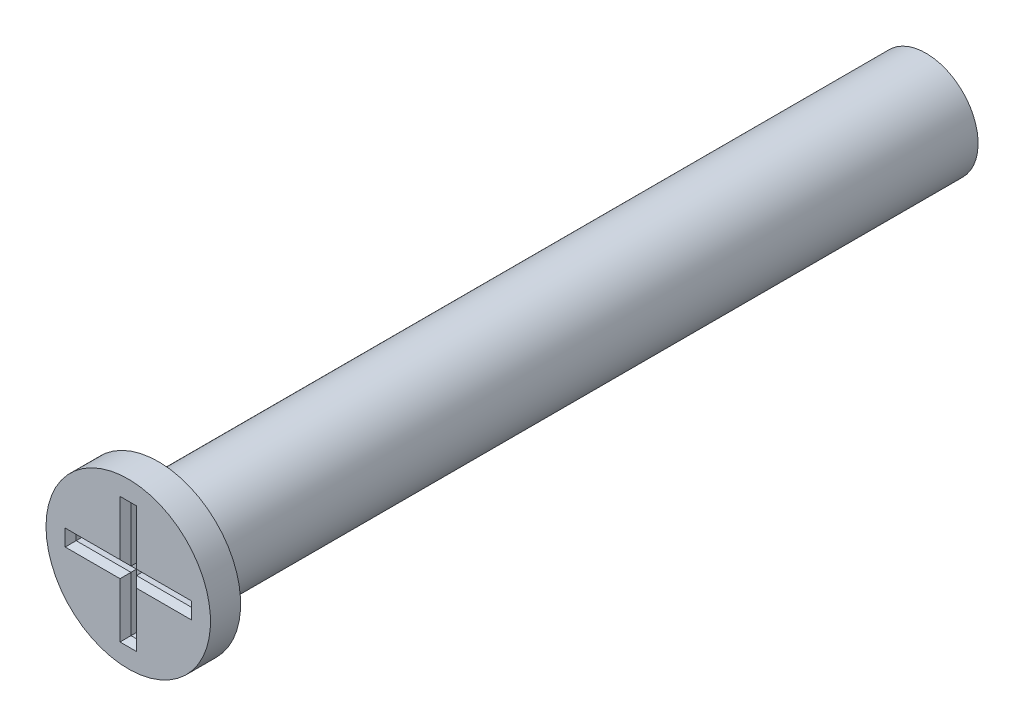
ISO-10303-21;
HEADER;
FILE_DESCRIPTION(('STEP AP214'),'2;1');
FILE_NAME('part.step','',(''),(''),'','','');
FILE_SCHEMA(('AUTOMOTIVE_DESIGN { 1 0 10303 214 1 1 1 1 }'));
ENDSEC;
DATA;
#1=APPLICATION_CONTEXT('core data for automotive mechanical design processes');
#2=APPLICATION_PROTOCOL_DEFINITION('international standard','automotive_design',2000,#1);
#3=PRODUCT_CONTEXT('',#1,'mechanical');
#4=PRODUCT('Part','Part','',(#3));
#5=PRODUCT_RELATED_PRODUCT_CATEGORY('part','',(#4));
#6=PRODUCT_DEFINITION_FORMATION('','',#4);
#7=PRODUCT_DEFINITION_CONTEXT('part definition',#1,'design');
#8=PRODUCT_DEFINITION('design','',#6,#7);
#9=PRODUCT_DEFINITION_SHAPE('','',#8);
#10=(LENGTH_UNIT() NAMED_UNIT(*) SI_UNIT(.MILLI.,.METRE.));
#11=(NAMED_UNIT(*) PLANE_ANGLE_UNIT() SI_UNIT($,.RADIAN.));
#12=(NAMED_UNIT(*) SI_UNIT($,.STERADIAN.) SOLID_ANGLE_UNIT());
#13=UNCERTAINTY_MEASURE_WITH_UNIT(LENGTH_MEASURE(1.E-05),#10,'distance_accuracy_value','');
#14=(GEOMETRIC_REPRESENTATION_CONTEXT(3) GLOBAL_UNCERTAINTY_ASSIGNED_CONTEXT((#13)) GLOBAL_UNIT_ASSIGNED_CONTEXT((#10,
#11,#12)) REPRESENTATION_CONTEXT('',''));
#15=CARTESIAN_POINT('',(0.,0.,0.));
#16=DIRECTION('',(0.,0.,1.));
#17=DIRECTION('',(1.,0.,0.));
#18=AXIS2_PLACEMENT_3D('',#15,#16,#17);
#19=CARTESIAN_POINT('',(0.,0.,14.35));
#20=DIRECTION('',(0.,0.,1.));
#21=DIRECTION('',(1.,0.,0.));
#22=AXIS2_PLACEMENT_3D('',#19,#20,#21);
#23=PLANE('',#22);
#24=DIRECTION('',(0.,-1.,0.));
#25=VECTOR('',#24,1.);
#26=CARTESIAN_POINT('',(-0.05,1.05,14.35));
#27=LINE('',#26,#25);
#28=CARTESIAN_POINT('',(-0.05,1.05,14.35));
#29=VERTEX_POINT('',#28);
#30=CARTESIAN_POINT('',(-0.05,0.0500000000000001,14.35));
#31=VERTEX_POINT('',#30);
#32=EDGE_CURVE('E139',#29,#31,#27,.T.);
#33=ORIENTED_EDGE('',*,*,#32,.T.);
#34=DIRECTION('',(-1.,0.,0.));
#35=VECTOR('',#34,1.);
#36=CARTESIAN_POINT('',(-0.05,0.0500000000000001,14.35));
#37=LINE('',#36,#35);
#38=CARTESIAN_POINT('',(-1.05,0.05,14.35));
#39=VERTEX_POINT('',#38);
#40=EDGE_CURVE('E141',#31,#39,#37,.T.);
#41=ORIENTED_EDGE('',*,*,#40,.T.);
#42=DIRECTION('',(0.,1.,0.));
#43=VECTOR('',#42,1.);
#44=CARTESIAN_POINT('',(-1.05,0.0499999999999999,14.35));
#45=LINE('',#44,#43);
#46=CARTESIAN_POINT('',(-1.05,-0.0500000000000005,14.35));
#47=VERTEX_POINT('',#46);
#48=EDGE_CURVE('E143',#39,#47,#45,.F.);
#49=ORIENTED_EDGE('',*,*,#48,.T.);
#50=DIRECTION('',(1.,0.,0.));
#51=VECTOR('',#50,1.);
#52=CARTESIAN_POINT('',(-1.05,-0.0500000000000005,14.35));
#53=LINE('',#52,#51);
#54=CARTESIAN_POINT('',(-0.0500000000000001,-0.0500000000000003,14.35));
#55=VERTEX_POINT('',#54);
#56=EDGE_CURVE('E281',#47,#55,#53,.T.);
#57=ORIENTED_EDGE('',*,*,#56,.T.);
#58=DIRECTION('',(0.,-1.,0.));
#59=VECTOR('',#58,1.);
#60=CARTESIAN_POINT('',(-0.05,-0.05,14.35));
#61=LINE('',#60,#59);
#62=CARTESIAN_POINT('',(-0.0499999999999998,-1.05,14.35));
#63=VERTEX_POINT('',#62);
#64=EDGE_CURVE('E285',#55,#63,#61,.T.);
#65=ORIENTED_EDGE('',*,*,#64,.T.);
#66=DIRECTION('',(1.,0.,0.));
#67=VECTOR('',#66,1.);
#68=CARTESIAN_POINT('',(-0.0499999999999995,-1.05,14.35));
#69=LINE('',#68,#67);
#70=CARTESIAN_POINT('',(0.0499999999999995,-1.05,14.35));
#71=VERTEX_POINT('',#70);
#72=EDGE_CURVE('E289',#63,#71,#69,.T.);
#73=ORIENTED_EDGE('',*,*,#72,.T.);
#74=DIRECTION('',(0.,1.,0.));
#75=VECTOR('',#74,1.);
#76=CARTESIAN_POINT('',(0.0499999999999995,-1.05,14.35));
#77=LINE('',#76,#75);
#78=CARTESIAN_POINT('',(0.0499999999999998,-0.0500000000000001,14.35));
#79=VERTEX_POINT('',#78);
#80=EDGE_CURVE('E293',#71,#79,#77,.T.);
#81=ORIENTED_EDGE('',*,*,#80,.T.);
#82=DIRECTION('',(1.,0.,0.));
#83=VECTOR('',#82,1.);
#84=CARTESIAN_POINT('',(0.05,-0.0500000000000001,14.35));
#85=LINE('',#84,#83);
#86=CARTESIAN_POINT('',(1.05,-0.0500000000000002,14.35));
#87=VERTEX_POINT('',#86);
#88=EDGE_CURVE('E297',#79,#87,#85,.T.);
#89=ORIENTED_EDGE('',*,*,#88,.T.);
#90=DIRECTION('',(0.,1.,0.));
#91=VECTOR('',#90,1.);
#92=CARTESIAN_POINT('',(1.05,-0.0500000000000003,14.35));
#93=LINE('',#92,#91);
#94=CARTESIAN_POINT('',(1.05,0.0499999999999997,14.35));
#95=VERTEX_POINT('',#94);
#96=EDGE_CURVE('E301',#87,#95,#93,.T.);
#97=ORIENTED_EDGE('',*,*,#96,.T.);
#98=DIRECTION('',(-1.,0.,0.));
#99=VECTOR('',#98,1.);
#100=CARTESIAN_POINT('',(1.05,0.0499999999999997,14.35));
#101=LINE('',#100,#99);
#102=CARTESIAN_POINT('',(0.0500000000000001,0.0499999999999999,14.35));
#103=VERTEX_POINT('',#102);
#104=EDGE_CURVE('E305',#95,#103,#101,.T.);
#105=ORIENTED_EDGE('',*,*,#104,.T.);
#106=DIRECTION('',(0.,1.,0.));
#107=VECTOR('',#106,1.);
#108=CARTESIAN_POINT('',(0.05,0.0500000000000003,14.35));
#109=LINE('',#108,#107);
#110=CARTESIAN_POINT('',(0.0500000000000001,1.05,14.35));
#111=VERTEX_POINT('',#110);
#112=EDGE_CURVE('E309',#103,#111,#109,.T.);
#113=ORIENTED_EDGE('',*,*,#112,.T.);
#114=DIRECTION('',(1.,0.,0.));
#115=VECTOR('',#114,1.);
#116=CARTESIAN_POINT('',(0.05,1.05,14.35));
#117=LINE('',#116,#115);
#118=EDGE_CURVE('E313',#111,#29,#117,.F.);
#119=ORIENTED_EDGE('',*,*,#118,.T.);
#120=EDGE_LOOP('',(#33,#41,#49,#57,#65,#73,#81,#89,#97,#105,#113,#119));
#121=FACE_BOUND('',#120,.T.);
#122=ADVANCED_FACE('F16',(#121),#23,.T.);
#123=CARTESIAN_POINT('',(-1.05,0.0499999999999999,14.35));
#124=DIRECTION('',(-1.,0.,0.));
#125=DIRECTION('',(0.,0.,1.));
#126=AXIS2_PLACEMENT_3D('',#123,#124,#125);
#127=PLANE('',#126);
#128=DIRECTION('',(0.,1.,0.));
#129=VECTOR('',#128,1.);
#130=CARTESIAN_POINT('',(-1.05,0.0499999999999999,14.45));
#131=LINE('',#130,#129);
#132=CARTESIAN_POINT('',(-1.05,-0.0500000000000005,14.45));
#133=VERTEX_POINT('',#132);
#134=CARTESIAN_POINT('',(-1.05,0.0499999999999999,14.45));
#135=VERTEX_POINT('',#134);
#136=EDGE_CURVE('E276',#133,#135,#131,.T.);
#137=ORIENTED_EDGE('',*,*,#136,.F.);
#138=DIRECTION('',(0.,0.,1.));
#139=VECTOR('',#138,1.);
#140=CARTESIAN_POINT('',(-1.05,-0.0500000000000005,14.35));
#141=LINE('',#140,#139);
#142=EDGE_CURVE('E154',#133,#47,#141,.F.);
#143=ORIENTED_EDGE('',*,*,#142,.T.);
#144=ORIENTED_EDGE('',*,*,#48,.F.);
#145=DIRECTION('',(0.,0.,1.));
#146=VECTOR('',#145,1.);
#147=CARTESIAN_POINT('',(-1.05,0.0499999999999999,14.35));
#148=LINE('',#147,#146);
#149=EDGE_CURVE('E148',#39,#135,#148,.T.);
#150=ORIENTED_EDGE('',*,*,#149,.T.);
#151=EDGE_LOOP('',(#137,#143,#144,#150));
#152=FACE_BOUND('',#151,.T.);
#153=ADVANCED_FACE('F151',(#152),#127,.F.);
#154=CARTESIAN_POINT('',(-0.05,0.0500000000000001,14.35));
#155=DIRECTION('',(0.,1.,0.));
#156=DIRECTION('',(-1.,0.,0.));
#157=AXIS2_PLACEMENT_3D('',#154,#155,#156);
#158=PLANE('',#157);
#159=DIRECTION('',(1.,0.,0.));
#160=VECTOR('',#159,1.);
#161=CARTESIAN_POINT('',(-0.05,0.05,14.45));
#162=LINE('',#161,#160);
#163=CARTESIAN_POINT('',(-0.05,0.0500000000000001,14.45));
#164=VERTEX_POINT('',#163);
#165=EDGE_CURVE('E160',#135,#164,#162,.T.);
#166=ORIENTED_EDGE('',*,*,#165,.F.);
#167=ORIENTED_EDGE('',*,*,#149,.F.);
#168=ORIENTED_EDGE('',*,*,#40,.F.);
#169=DIRECTION('',(0.,0.,1.));
#170=VECTOR('',#169,1.);
#171=CARTESIAN_POINT('',(-0.05,0.0500000000000001,14.35));
#172=LINE('',#171,#170);
#173=EDGE_CURVE('E163',#31,#164,#172,.T.);
#174=ORIENTED_EDGE('',*,*,#173,.T.);
#175=EDGE_LOOP('',(#166,#167,#168,#174));
#176=FACE_BOUND('',#175,.T.);
#177=ADVANCED_FACE('F158',(#176),#158,.F.);
#178=CARTESIAN_POINT('',(-0.05,1.05,14.35));
#179=DIRECTION('',(-1.,0.,0.));
#180=DIRECTION('',(0.,-1.,0.));
#181=AXIS2_PLACEMENT_3D('',#178,#179,#180);
#182=PLANE('',#181);
#183=DIRECTION('',(0.,1.,0.));
#184=VECTOR('',#183,1.);
#185=CARTESIAN_POINT('',(-0.05,1.05,14.45));
#186=LINE('',#185,#184);
#187=CARTESIAN_POINT('',(-0.05,1.05,14.45));
#188=VERTEX_POINT('',#187);
#189=EDGE_CURVE('E267',#164,#188,#186,.T.);
#190=ORIENTED_EDGE('',*,*,#189,.F.);
#191=ORIENTED_EDGE('',*,*,#173,.F.);
#192=ORIENTED_EDGE('',*,*,#32,.F.);
#193=DIRECTION('',(0.,0.,1.));
#194=VECTOR('',#193,1.);
#195=CARTESIAN_POINT('',(-0.05,1.05,14.35));
#196=LINE('',#195,#194);
#197=EDGE_CURVE('E311',#29,#188,#196,.T.);
#198=ORIENTED_EDGE('',*,*,#197,.T.);
#199=EDGE_LOOP('',(#190,#191,#192,#198));
#200=FACE_BOUND('',#199,.T.);
#201=ADVANCED_FACE('F320',(#200),#182,.F.);
#202=CARTESIAN_POINT('',(0.05,1.05,14.35));
#203=DIRECTION('',(0.,1.,0.));
#204=DIRECTION('',(0.,0.,1.));
#205=AXIS2_PLACEMENT_3D('',#202,#203,#204);
#206=PLANE('',#205);
#207=DIRECTION('',(1.,0.,0.));
#208=VECTOR('',#207,1.);
#209=CARTESIAN_POINT('',(0.05,1.05,14.45));
#210=LINE('',#209,#208);
#211=CARTESIAN_POINT('',(0.05,1.05,14.45));
#212=VERTEX_POINT('',#211);
#213=EDGE_CURVE('E261',#188,#212,#210,.T.);
#214=ORIENTED_EDGE('',*,*,#213,.F.);
#215=ORIENTED_EDGE('',*,*,#197,.F.);
#216=ORIENTED_EDGE('',*,*,#118,.F.);
#217=DIRECTION('',(0.,0.,1.));
#218=VECTOR('',#217,1.);
#219=CARTESIAN_POINT('',(0.05,1.05,14.35));
#220=LINE('',#219,#218);
#221=EDGE_CURVE('E307',#111,#212,#220,.T.);
#222=ORIENTED_EDGE('',*,*,#221,.T.);
#223=EDGE_LOOP('',(#214,#215,#216,#222));
#224=FACE_BOUND('',#223,.T.);
#225=ADVANCED_FACE('F386',(#224),#206,.F.);
#226=CARTESIAN_POINT('',(0.05,0.0500000000000003,14.35));
#227=DIRECTION('',(1.,0.,0.));
#228=DIRECTION('',(0.,1.,0.));
#229=AXIS2_PLACEMENT_3D('',#226,#227,#228);
#230=PLANE('',#229);
#231=DIRECTION('',(0.,1.,0.));
#232=VECTOR('',#231,1.);
#233=CARTESIAN_POINT('',(0.05,0.0500000000000003,14.45));
#234=LINE('',#233,#232);
#235=CARTESIAN_POINT('',(0.05,0.0500000000000002,14.45));
#236=VERTEX_POINT('',#235);
#237=EDGE_CURVE('E255',#212,#236,#234,.F.);
#238=ORIENTED_EDGE('',*,*,#237,.F.);
#239=ORIENTED_EDGE('',*,*,#221,.F.);
#240=ORIENTED_EDGE('',*,*,#112,.F.);
#241=DIRECTION('',(0.,0.,1.));
#242=VECTOR('',#241,1.);
#243=CARTESIAN_POINT('',(0.0500000000000001,0.0500000000000001,14.35));
#244=LINE('',#243,#242);
#245=EDGE_CURVE('E303',#103,#236,#244,.T.);
#246=ORIENTED_EDGE('',*,*,#245,.T.);
#247=EDGE_LOOP('',(#238,#239,#240,#246));
#248=FACE_BOUND('',#247,.T.);
#249=ADVANCED_FACE('F384',(#248),#230,.F.);
#250=CARTESIAN_POINT('',(1.05,0.0499999999999997,14.35));
#251=DIRECTION('',(0.,1.,0.));
#252=DIRECTION('',(-1.,0.,0.));
#253=AXIS2_PLACEMENT_3D('',#250,#251,#252);
#254=PLANE('',#253);
#255=DIRECTION('',(1.,0.,0.));
#256=VECTOR('',#255,1.);
#257=CARTESIAN_POINT('',(1.05,0.0499999999999999,14.45));
#258=LINE('',#257,#256);
#259=CARTESIAN_POINT('',(1.05,0.0499999999999997,14.45));
#260=VERTEX_POINT('',#259);
#261=EDGE_CURVE('E249',#236,#260,#258,.T.);
#262=ORIENTED_EDGE('',*,*,#261,.F.);
#263=ORIENTED_EDGE('',*,*,#245,.F.);
#264=ORIENTED_EDGE('',*,*,#104,.F.);
#265=DIRECTION('',(0.,0.,1.));
#266=VECTOR('',#265,1.);
#267=CARTESIAN_POINT('',(1.05,0.0499999999999997,14.35));
#268=LINE('',#267,#266);
#269=EDGE_CURVE('E299',#95,#260,#268,.T.);
#270=ORIENTED_EDGE('',*,*,#269,.T.);
#271=EDGE_LOOP('',(#262,#263,#264,#270));
#272=FACE_BOUND('',#271,.T.);
#273=ADVANCED_FACE('F377',(#272),#254,.F.);
#274=CARTESIAN_POINT('',(1.05,-0.0500000000000003,14.35));
#275=DIRECTION('',(1.,0.,0.));
#276=DIRECTION('',(0.,1.,0.));
#277=AXIS2_PLACEMENT_3D('',#274,#275,#276);
#278=PLANE('',#277);
#279=DIRECTION('',(0.,1.,0.));
#280=VECTOR('',#279,1.);
#281=CARTESIAN_POINT('',(1.05,-0.0500000000000003,14.45));
#282=LINE('',#281,#280);
#283=CARTESIAN_POINT('',(1.05,-0.0500000000000003,14.45));
#284=VERTEX_POINT('',#283);
#285=EDGE_CURVE('E243',#260,#284,#282,.F.);
#286=ORIENTED_EDGE('',*,*,#285,.F.);
#287=ORIENTED_EDGE('',*,*,#269,.F.);
#288=ORIENTED_EDGE('',*,*,#96,.F.);
#289=DIRECTION('',(0.,0.,1.));
#290=VECTOR('',#289,1.);
#291=CARTESIAN_POINT('',(1.05,-0.0500000000000002,14.35));
#292=LINE('',#291,#290);
#293=EDGE_CURVE('E295',#87,#284,#292,.T.);
#294=ORIENTED_EDGE('',*,*,#293,.T.);
#295=EDGE_LOOP('',(#286,#287,#288,#294));
#296=FACE_BOUND('',#295,.T.);
#297=ADVANCED_FACE('F365',(#296),#278,.F.);
#298=CARTESIAN_POINT('',(0.05,-0.0500000000000001,14.35));
#299=DIRECTION('',(0.,-1.,0.));
#300=DIRECTION('',(1.,0.,0.));
#301=AXIS2_PLACEMENT_3D('',#298,#299,#300);
#302=PLANE('',#301);
#303=DIRECTION('',(1.,0.,0.));
#304=VECTOR('',#303,1.);
#305=CARTESIAN_POINT('',(0.05,-0.0500000000000002,14.45));
#306=LINE('',#305,#304);
#307=CARTESIAN_POINT('',(0.05,-0.0500000000000001,14.45));
#308=VERTEX_POINT('',#307);
#309=EDGE_CURVE('E237',#284,#308,#306,.F.);
#310=ORIENTED_EDGE('',*,*,#309,.F.);
#311=ORIENTED_EDGE('',*,*,#293,.F.);
#312=ORIENTED_EDGE('',*,*,#88,.F.);
#313=DIRECTION('',(0.,0.,1.));
#314=VECTOR('',#313,1.);
#315=CARTESIAN_POINT('',(0.05,-0.0500000000000001,14.35));
#316=LINE('',#315,#314);
#317=EDGE_CURVE('E291',#79,#308,#316,.T.);
#318=ORIENTED_EDGE('',*,*,#317,.T.);
#319=EDGE_LOOP('',(#310,#311,#312,#318));
#320=FACE_BOUND('',#319,.T.);
#321=ADVANCED_FACE('F362',(#320),#302,.F.);
#322=CARTESIAN_POINT('',(0.0499999999999995,-1.05,14.35));
#323=DIRECTION('',(1.,0.,0.));
#324=DIRECTION('',(0.,1.,0.));
#325=AXIS2_PLACEMENT_3D('',#322,#323,#324);
#326=PLANE('',#325);
#327=DIRECTION('',(0.,1.,0.));
#328=VECTOR('',#327,1.);
#329=CARTESIAN_POINT('',(0.0499999999999998,-1.05,14.45));
#330=LINE('',#329,#328);
#331=CARTESIAN_POINT('',(0.0499999999999996,-1.05,14.45));
#332=VERTEX_POINT('',#331);
#333=EDGE_CURVE('E231',#308,#332,#330,.F.);
#334=ORIENTED_EDGE('',*,*,#333,.F.);
#335=ORIENTED_EDGE('',*,*,#317,.F.);
#336=ORIENTED_EDGE('',*,*,#80,.F.);
#337=DIRECTION('',(0.,0.,-1.));
#338=VECTOR('',#337,1.);
#339=CARTESIAN_POINT('',(0.0499999999999995,-1.05,14.35));
#340=LINE('',#339,#338);
#341=EDGE_CURVE('E287',#71,#332,#340,.F.);
#342=ORIENTED_EDGE('',*,*,#341,.T.);
#343=EDGE_LOOP('',(#334,#335,#336,#342));
#344=FACE_BOUND('',#343,.T.);
#345=ADVANCED_FACE('F355',(#344),#326,.F.);
#346=CARTESIAN_POINT('',(-0.0499999999999995,-1.05,14.35));
#347=DIRECTION('',(0.,-1.,0.));
#348=DIRECTION('',(0.,0.,-1.));
#349=AXIS2_PLACEMENT_3D('',#346,#347,#348);
#350=PLANE('',#349);
#351=DIRECTION('',(1.,0.,0.));
#352=VECTOR('',#351,1.);
#353=CARTESIAN_POINT('',(-0.0499999999999995,-1.05,14.45));
#354=LINE('',#353,#352);
#355=CARTESIAN_POINT('',(-0.0499999999999995,-1.05,14.45));
#356=VERTEX_POINT('',#355);
#357=EDGE_CURVE('E225',#332,#356,#354,.F.);
#358=ORIENTED_EDGE('',*,*,#357,.F.);
#359=ORIENTED_EDGE('',*,*,#341,.F.);
#360=ORIENTED_EDGE('',*,*,#72,.F.);
#361=DIRECTION('',(0.,0.,1.));
#362=VECTOR('',#361,1.);
#363=CARTESIAN_POINT('',(-0.0499999999999995,-1.05,14.35));
#364=LINE('',#363,#362);
#365=EDGE_CURVE('E283',#63,#356,#364,.T.);
#366=ORIENTED_EDGE('',*,*,#365,.T.);
#367=EDGE_LOOP('',(#358,#359,#360,#366));
#368=FACE_BOUND('',#367,.T.);
#369=ADVANCED_FACE('F344',(#368),#350,.F.);
#370=CARTESIAN_POINT('',(-0.05,-0.05,14.35));
#371=DIRECTION('',(-1.,0.,0.));
#372=DIRECTION('',(0.,-1.,0.));
#373=AXIS2_PLACEMENT_3D('',#370,#371,#372);
#374=PLANE('',#373);
#375=DIRECTION('',(0.,1.,0.));
#376=VECTOR('',#375,1.);
#377=CARTESIAN_POINT('',(-0.0499999999999997,-0.05,14.45));
#378=LINE('',#377,#376);
#379=CARTESIAN_POINT('',(-0.05,-0.0500000000000001,14.45));
#380=VERTEX_POINT('',#379);
#381=EDGE_CURVE('E220',#356,#380,#378,.T.);
#382=ORIENTED_EDGE('',*,*,#381,.F.);
#383=ORIENTED_EDGE('',*,*,#365,.F.);
#384=ORIENTED_EDGE('',*,*,#64,.F.);
#385=DIRECTION('',(0.,0.,1.));
#386=VECTOR('',#385,1.);
#387=CARTESIAN_POINT('',(-0.0500000000000001,-0.0500000000000002,14.35));
#388=LINE('',#387,#386);
#389=EDGE_CURVE('E279',#55,#380,#388,.T.);
#390=ORIENTED_EDGE('',*,*,#389,.T.);
#391=EDGE_LOOP('',(#382,#383,#384,#390));
#392=FACE_BOUND('',#391,.T.);
#393=ADVANCED_FACE('F341',(#392),#374,.F.);
#394=CARTESIAN_POINT('',(-1.05,-0.0500000000000005,14.35));
#395=DIRECTION('',(0.,-1.,0.));
#396=DIRECTION('',(1.,0.,0.));
#397=AXIS2_PLACEMENT_3D('',#394,#395,#396);
#398=PLANE('',#397);
#399=DIRECTION('',(1.,0.,0.));
#400=VECTOR('',#399,1.);
#401=CARTESIAN_POINT('',(-1.05,-0.0500000000000003,14.45));
#402=LINE('',#401,#400);
#403=EDGE_CURVE('E216',#380,#133,#402,.F.);
#404=ORIENTED_EDGE('',*,*,#403,.F.);
#405=ORIENTED_EDGE('',*,*,#389,.F.);
#406=ORIENTED_EDGE('',*,*,#56,.F.);
#407=ORIENTED_EDGE('',*,*,#142,.F.);
#408=EDGE_LOOP('',(#404,#405,#406,#407));
#409=FACE_BOUND('',#408,.T.);
#410=ADVANCED_FACE('F335',(#409),#398,.F.);
#411=CARTESIAN_POINT('',(-1.05,0.0499999999999999,14.45));
#412=DIRECTION('',(0.707106781186545,0.,0.70710678118655));
#413=DIRECTION('',(0.70710678118655,0.,-0.707106781186545));
#414=AXIS2_PLACEMENT_3D('',#411,#412,#413);
#415=PLANE('',#414);
#416=DIRECTION('',(0.57735026918962,-0.577350269189629,-0.577350269189628));
#417=VECTOR('',#416,1.);
#418=CARTESIAN_POINT('',(-1.15,0.150000000000001,14.55));
#419=LINE('',#418,#417);
#420=CARTESIAN_POINT('',(-1.15,0.15,14.55));
#421=VERTEX_POINT('',#420);
#422=EDGE_CURVE('E274',#421,#135,#419,.T.);
#423=ORIENTED_EDGE('',*,*,#422,.F.);
#424=DIRECTION('',(0.,1.,0.));
#425=VECTOR('',#424,1.);
#426=CARTESIAN_POINT('',(-1.15,0.,14.55));
#427=LINE('',#426,#425);
#428=CARTESIAN_POINT('',(-1.15,-0.15,14.55));
#429=VERTEX_POINT('',#428);
#430=EDGE_CURVE('E211',#429,#421,#427,.T.);
#431=ORIENTED_EDGE('',*,*,#430,.F.);
#432=DIRECTION('',(-0.577350269189626,-0.577350269189629,0.577350269189623));
#433=VECTOR('',#432,1.);
#434=CARTESIAN_POINT('',(-1.05,-0.0500000000000005,14.45));
#435=LINE('',#434,#433);
#436=EDGE_CURVE('E213',#133,#429,#435,.T.);
#437=ORIENTED_EDGE('',*,*,#436,.F.);
#438=ORIENTED_EDGE('',*,*,#136,.T.);
#439=EDGE_LOOP('',(#423,#431,#437,#438));
#440=FACE_BOUND('',#439,.T.);
#441=ADVANCED_FACE('F329',(#440),#415,.T.);
#442=CARTESIAN_POINT('',(-0.05,0.0500000000000001,14.45));
#443=DIRECTION('',(0.,-0.707106781186546,0.70710678118655));
#444=DIRECTION('',(0.,-0.70710678118655,-0.707106781186546));
#445=AXIS2_PLACEMENT_3D('',#442,#443,#444);
#446=PLANE('',#445);
#447=ORIENTED_EDGE('',*,*,#422,.T.);
#448=ORIENTED_EDGE('',*,*,#165,.T.);
#449=DIRECTION('',(0.577350269189629,-0.577350269189625,-0.577350269189623));
#450=VECTOR('',#449,1.);
#451=CARTESIAN_POINT('',(-0.15,0.15,14.55));
#452=LINE('',#451,#450);
#453=CARTESIAN_POINT('',(-0.15,0.15,14.55));
#454=VERTEX_POINT('',#453);
#455=EDGE_CURVE('E270',#454,#164,#452,.T.);
#456=ORIENTED_EDGE('',*,*,#455,.F.);
#457=DIRECTION('',(1.,0.,0.));
#458=VECTOR('',#457,1.);
#459=CARTESIAN_POINT('',(0.,0.15,14.55));
#460=LINE('',#459,#458);
#461=EDGE_CURVE('E208',#421,#454,#460,.T.);
#462=ORIENTED_EDGE('',*,*,#461,.F.);
#463=EDGE_LOOP('',(#447,#448,#456,#462));
#464=FACE_BOUND('',#463,.T.);
#465=ADVANCED_FACE('F317',(#464),#446,.T.);
#466=CARTESIAN_POINT('',(-0.05,1.05,14.45));
#467=DIRECTION('',(0.707106781186545,0.,0.70710678118655));
#468=DIRECTION('',(0.70710678118655,0.,-0.707106781186545));
#469=AXIS2_PLACEMENT_3D('',#466,#467,#468);
#470=PLANE('',#469);
#471=ORIENTED_EDGE('',*,*,#455,.T.);
#472=ORIENTED_EDGE('',*,*,#189,.T.);
#473=DIRECTION('',(0.577350269189626,-0.577350269189629,-0.577350269189623));
#474=VECTOR('',#473,1.);
#475=CARTESIAN_POINT('',(-0.15,1.15,14.55));
#476=LINE('',#475,#474);
#477=CARTESIAN_POINT('',(-0.15,1.15,14.55));
#478=VERTEX_POINT('',#477);
#479=EDGE_CURVE('E264',#478,#188,#476,.T.);
#480=ORIENTED_EDGE('',*,*,#479,.F.);
#481=DIRECTION('',(0.,1.,0.));
#482=VECTOR('',#481,1.);
#483=CARTESIAN_POINT('',(-0.15,0.,14.55));
#484=LINE('',#483,#482);
#485=EDGE_CURVE('E205',#454,#478,#484,.T.);
#486=ORIENTED_EDGE('',*,*,#485,.F.);
#487=EDGE_LOOP('',(#471,#472,#480,#486));
#488=FACE_BOUND('',#487,.T.);
#489=ADVANCED_FACE('F324',(#488),#470,.T.);
#490=CARTESIAN_POINT('',(0.05,1.05,14.45));
#491=DIRECTION('',(0.,-0.707106781186545,0.70710678118655));
#492=DIRECTION('',(0.,-0.70710678118655,-0.707106781186545));
#493=AXIS2_PLACEMENT_3D('',#490,#491,#492);
#494=PLANE('',#493);
#495=ORIENTED_EDGE('',*,*,#479,.T.);
#496=ORIENTED_EDGE('',*,*,#213,.T.);
#497=DIRECTION('',(-0.577350269189629,-0.577350269189625,-0.577350269189623));
#498=VECTOR('',#497,1.);
#499=CARTESIAN_POINT('',(0.15,1.15,14.55));
#500=LINE('',#499,#498);
#501=CARTESIAN_POINT('',(0.15,1.15,14.55));
#502=VERTEX_POINT('',#501);
#503=EDGE_CURVE('E258',#502,#212,#500,.T.);
#504=ORIENTED_EDGE('',*,*,#503,.F.);
#505=DIRECTION('',(1.,0.,0.));
#506=VECTOR('',#505,1.);
#507=CARTESIAN_POINT('',(0.,1.15,14.55));
#508=LINE('',#507,#506);
#509=EDGE_CURVE('E202',#478,#502,#508,.T.);
#510=ORIENTED_EDGE('',*,*,#509,.F.);
#511=EDGE_LOOP('',(#495,#496,#504,#510));
#512=FACE_BOUND('',#511,.T.);
#513=ADVANCED_FACE('F388',(#512),#494,.T.);
#514=CARTESIAN_POINT('',(0.05,0.0500000000000003,14.45));
#515=DIRECTION('',(-0.707106781186545,0.,0.70710678118655));
#516=DIRECTION('',(0.70710678118655,0.,0.707106781186545));
#517=AXIS2_PLACEMENT_3D('',#514,#515,#516);
#518=PLANE('',#517);
#519=ORIENTED_EDGE('',*,*,#503,.T.);
#520=ORIENTED_EDGE('',*,*,#237,.T.);
#521=DIRECTION('',(-0.577350269189625,-0.577350269189629,-0.577350269189623));
#522=VECTOR('',#521,1.);
#523=CARTESIAN_POINT('',(0.15,0.150000000000001,14.55));
#524=LINE('',#523,#522);
#525=CARTESIAN_POINT('',(0.150000000000001,0.15,14.55));
#526=VERTEX_POINT('',#525);
#527=EDGE_CURVE('E252',#526,#236,#524,.T.);
#528=ORIENTED_EDGE('',*,*,#527,.F.);
#529=DIRECTION('',(0.,1.,0.));
#530=VECTOR('',#529,1.);
#531=CARTESIAN_POINT('',(0.15,0.,14.55));
#532=LINE('',#531,#530);
#533=EDGE_CURVE('E199',#502,#526,#532,.F.);
#534=ORIENTED_EDGE('',*,*,#533,.F.);
#535=EDGE_LOOP('',(#519,#520,#528,#534));
#536=FACE_BOUND('',#535,.T.);
#537=ADVANCED_FACE('F391',(#536),#518,.T.);
#538=CARTESIAN_POINT('',(1.05,0.0499999999999997,14.45));
#539=DIRECTION('',(0.,-0.707106781186545,0.70710678118655));
#540=DIRECTION('',(0.,-0.70710678118655,-0.707106781186545));
#541=AXIS2_PLACEMENT_3D('',#538,#539,#540);
#542=PLANE('',#541);
#543=ORIENTED_EDGE('',*,*,#527,.T.);
#544=ORIENTED_EDGE('',*,*,#261,.T.);
#545=DIRECTION('',(-0.577350269189627,-0.577350269189623,-0.577350269189628));
#546=VECTOR('',#545,1.);
#547=CARTESIAN_POINT('',(1.15,0.15,14.55));
#548=LINE('',#547,#546);
#549=CARTESIAN_POINT('',(1.15,0.15,14.55));
#550=VERTEX_POINT('',#549);
#551=EDGE_CURVE('E246',#550,#260,#548,.T.);
#552=ORIENTED_EDGE('',*,*,#551,.F.);
#553=DIRECTION('',(1.,0.,0.));
#554=VECTOR('',#553,1.);
#555=CARTESIAN_POINT('',(0.,0.15,14.55));
#556=LINE('',#555,#554);
#557=EDGE_CURVE('E196',#526,#550,#556,.T.);
#558=ORIENTED_EDGE('',*,*,#557,.F.);
#559=EDGE_LOOP('',(#543,#544,#552,#558));
#560=FACE_BOUND('',#559,.T.);
#561=ADVANCED_FACE('F373',(#560),#542,.T.);
#562=CARTESIAN_POINT('',(1.05,-0.0500000000000003,14.45));
#563=DIRECTION('',(-0.707106781186546,0.,0.70710678118655));
#564=DIRECTION('',(0.70710678118655,0.,0.707106781186546));
#565=AXIS2_PLACEMENT_3D('',#562,#563,#564);
#566=PLANE('',#565);
#567=ORIENTED_EDGE('',*,*,#551,.T.);
#568=ORIENTED_EDGE('',*,*,#285,.T.);
#569=DIRECTION('',(-0.577350269189625,0.577350269189629,-0.577350269189623));
#570=VECTOR('',#569,1.);
#571=CARTESIAN_POINT('',(1.15,-0.150000000000001,14.55));
#572=LINE('',#571,#570);
#573=CARTESIAN_POINT('',(1.15,-0.15,14.55));
#574=VERTEX_POINT('',#573);
#575=EDGE_CURVE('E240',#574,#284,#572,.T.);
#576=ORIENTED_EDGE('',*,*,#575,.F.);
#577=DIRECTION('',(0.,1.,0.));
#578=VECTOR('',#577,1.);
#579=CARTESIAN_POINT('',(1.15,0.,14.55));
#580=LINE('',#579,#578);
#581=EDGE_CURVE('E193',#550,#574,#580,.F.);
#582=ORIENTED_EDGE('',*,*,#581,.F.);
#583=EDGE_LOOP('',(#567,#568,#576,#582));
#584=FACE_BOUND('',#583,.T.);
#585=ADVANCED_FACE('F368',(#584),#566,.T.);
#586=CARTESIAN_POINT('',(0.05,-0.0500000000000001,14.45));
#587=DIRECTION('',(0.,0.707106781186545,0.70710678118655));
#588=DIRECTION('',(0.,-0.70710678118655,0.707106781186545));
#589=AXIS2_PLACEMENT_3D('',#586,#587,#588);
#590=PLANE('',#589);
#591=ORIENTED_EDGE('',*,*,#575,.T.);
#592=ORIENTED_EDGE('',*,*,#309,.T.);
#593=DIRECTION('',(-0.577350269189629,0.577350269189625,-0.577350269189623));
#594=VECTOR('',#593,1.);
#595=CARTESIAN_POINT('',(0.15,-0.15,14.55));
#596=LINE('',#595,#594);
#597=CARTESIAN_POINT('',(0.15,-0.15,14.55));
#598=VERTEX_POINT('',#597);
#599=EDGE_CURVE('E234',#598,#308,#596,.T.);
#600=ORIENTED_EDGE('',*,*,#599,.F.);
#601=DIRECTION('',(1.,0.,0.));
#602=VECTOR('',#601,1.);
#603=CARTESIAN_POINT('',(0.,-0.15,14.55));
#604=LINE('',#603,#602);
#605=EDGE_CURVE('E190',#574,#598,#604,.F.);
#606=ORIENTED_EDGE('',*,*,#605,.F.);
#607=EDGE_LOOP('',(#591,#592,#600,#606));
#608=FACE_BOUND('',#607,.T.);
#609=ADVANCED_FACE('F432',(#608),#590,.T.);
#610=CARTESIAN_POINT('',(0.0499999999999995,-1.05,14.45));
#611=DIRECTION('',(-0.707106781186545,0.,0.70710678118655));
#612=DIRECTION('',(0.70710678118655,0.,0.707106781186545));
#613=AXIS2_PLACEMENT_3D('',#610,#611,#612);
#614=PLANE('',#613);
#615=DIRECTION('',(-0.577350269189624,0.57735026918963,-0.577350269189623));
#616=VECTOR('',#615,1.);
#617=CARTESIAN_POINT('',(0.149999999999999,-1.15,14.55));
#618=LINE('',#617,#616);
#619=CARTESIAN_POINT('',(0.15,-1.15,14.55));
#620=VERTEX_POINT('',#619);
#621=EDGE_CURVE('E228',#620,#332,#618,.T.);
#622=ORIENTED_EDGE('',*,*,#621,.F.);
#623=DIRECTION('',(0.,1.,0.));
#624=VECTOR('',#623,1.);
#625=CARTESIAN_POINT('',(0.15,0.,14.55));
#626=LINE('',#625,#624);
#627=EDGE_CURVE('E187',#598,#620,#626,.F.);
#628=ORIENTED_EDGE('',*,*,#627,.F.);
#629=ORIENTED_EDGE('',*,*,#599,.T.);
#630=ORIENTED_EDGE('',*,*,#333,.T.);
#631=EDGE_LOOP('',(#622,#628,#629,#630));
#632=FACE_BOUND('',#631,.T.);
#633=ADVANCED_FACE('F351',(#632),#614,.T.);
#634=CARTESIAN_POINT('',(-0.0499999999999995,-1.05,14.45));
#635=DIRECTION('',(0.,0.707106781186545,0.70710678118655));
#636=DIRECTION('',(0.,-0.70710678118655,0.707106781186545));
#637=AXIS2_PLACEMENT_3D('',#634,#635,#636);
#638=PLANE('',#637);
#639=DIRECTION('',(0.577350269189629,0.577350269189626,-0.577350269189623));
#640=VECTOR('',#639,1.);
#641=CARTESIAN_POINT('',(-0.15,-1.15,14.55));
#642=LINE('',#641,#640);
#643=CARTESIAN_POINT('',(-0.149999999999999,-1.15,14.55));
#644=VERTEX_POINT('',#643);
#645=EDGE_CURVE('E222',#644,#356,#642,.T.);
#646=ORIENTED_EDGE('',*,*,#645,.F.);
#647=DIRECTION('',(1.,0.,0.));
#648=VECTOR('',#647,1.);
#649=CARTESIAN_POINT('',(0.,-1.15,14.55));
#650=LINE('',#649,#648);
#651=EDGE_CURVE('E182',#620,#644,#650,.F.);
#652=ORIENTED_EDGE('',*,*,#651,.F.);
#653=ORIENTED_EDGE('',*,*,#621,.T.);
#654=ORIENTED_EDGE('',*,*,#357,.T.);
#655=EDGE_LOOP('',(#646,#652,#653,#654));
#656=FACE_BOUND('',#655,.T.);
#657=ADVANCED_FACE('F347',(#656),#638,.T.);
#658=CARTESIAN_POINT('',(-0.05,-0.05,14.45));
#659=DIRECTION('',(0.707106781186545,0.,0.70710678118655));
#660=DIRECTION('',(0.70710678118655,0.,-0.707106781186545));
#661=AXIS2_PLACEMENT_3D('',#658,#659,#660);
#662=PLANE('',#661);
#663=DIRECTION('',(0.577350269189625,0.577350269189629,-0.577350269189623));
#664=VECTOR('',#663,1.);
#665=CARTESIAN_POINT('',(-0.15,-0.150000000000001,14.55));
#666=LINE('',#665,#664);
#667=CARTESIAN_POINT('',(-0.15,-0.15,14.55));
#668=VERTEX_POINT('',#667);
#669=EDGE_CURVE('E34',#668,#380,#666,.T.);
#670=ORIENTED_EDGE('',*,*,#669,.F.);
#671=DIRECTION('',(0.,1.,0.));
#672=VECTOR('',#671,1.);
#673=CARTESIAN_POINT('',(-0.149999999999999,0.,14.55));
#674=LINE('',#673,#672);
#675=EDGE_CURVE('E177',#644,#668,#674,.T.);
#676=ORIENTED_EDGE('',*,*,#675,.F.);
#677=ORIENTED_EDGE('',*,*,#645,.T.);
#678=ORIENTED_EDGE('',*,*,#381,.T.);
#679=EDGE_LOOP('',(#670,#676,#677,#678));
#680=FACE_BOUND('',#679,.T.);
#681=ADVANCED_FACE('F425',(#680),#662,.T.);
#682=CARTESIAN_POINT('',(-1.05,-0.0500000000000005,14.45));
#683=DIRECTION('',(0.,0.707106781186545,0.70710678118655));
#684=DIRECTION('',(0.,-0.70710678118655,0.707106781186545));
#685=AXIS2_PLACEMENT_3D('',#682,#683,#684);
#686=PLANE('',#685);
#687=ORIENTED_EDGE('',*,*,#436,.T.);
#688=DIRECTION('',(1.,0.,0.));
#689=VECTOR('',#688,1.);
#690=CARTESIAN_POINT('',(0.,-0.15,14.55));
#691=LINE('',#690,#689);
#692=EDGE_CURVE('E173',#668,#429,#691,.F.);
#693=ORIENTED_EDGE('',*,*,#692,.F.);
#694=ORIENTED_EDGE('',*,*,#669,.T.);
#695=ORIENTED_EDGE('',*,*,#403,.T.);
#696=EDGE_LOOP('',(#687,#693,#694,#695));
#697=FACE_BOUND('',#696,.T.);
#698=ADVANCED_FACE('F331',(#697),#686,.T.);
#699=CARTESIAN_POINT('',(0.,0.,14.55));
#700=DIRECTION('',(0.,0.,1.));
#701=DIRECTION('',(1.,0.,0.));
#702=AXIS2_PLACEMENT_3D('',#699,#700,#701);
#703=PLANE('',#702);
#704=CARTESIAN_POINT('',(0.,0.,14.55));
#705=DIRECTION('',(0.,0.,-1.));
#706=DIRECTION('',(-1.,0.,0.));
#707=AXIS2_PLACEMENT_3D('',#704,#705,#706);
#708=CIRCLE('',#707,1.5);
#709=CARTESIAN_POINT('',(-1.5,0.,14.55));
#710=VERTEX_POINT('',#709);
#711=EDGE_CURVE('E19',#710,#710,#708,.T.);
#712=ORIENTED_EDGE('',*,*,#711,.F.);
#713=EDGE_LOOP('',(#712));
#714=FACE_BOUND('',#713,.T.);
#715=ORIENTED_EDGE('',*,*,#675,.T.);
#716=ORIENTED_EDGE('',*,*,#692,.T.);
#717=ORIENTED_EDGE('',*,*,#430,.T.);
#718=ORIENTED_EDGE('',*,*,#461,.T.);
#719=ORIENTED_EDGE('',*,*,#485,.T.);
#720=ORIENTED_EDGE('',*,*,#509,.T.);
#721=ORIENTED_EDGE('',*,*,#533,.T.);
#722=ORIENTED_EDGE('',*,*,#557,.T.);
#723=ORIENTED_EDGE('',*,*,#581,.T.);
#724=ORIENTED_EDGE('',*,*,#605,.T.);
#725=ORIENTED_EDGE('',*,*,#627,.T.);
#726=ORIENTED_EDGE('',*,*,#651,.T.);
#727=EDGE_LOOP('',(#715,#716,#717,#718,#719,#720,#721,#722,#723,#724,#725,#726));
#728=FACE_BOUND('',#727,.T.);
#729=ADVANCED_FACE('F326',(#714,#728),#703,.T.);
#730=CARTESIAN_POINT('',(0.,0.,14.55));
#731=DIRECTION('',(0.,0.,-1.));
#732=DIRECTION('',(-1.,0.,0.));
#733=AXIS2_PLACEMENT_3D('',#730,#731,#732);
#734=CYLINDRICAL_SURFACE('',#733,1.5);
#735=CARTESIAN_POINT('',(0.,0.,14.));
#736=DIRECTION('',(0.,0.,-1.));
#737=DIRECTION('',(-1.,0.,0.));
#738=AXIS2_PLACEMENT_3D('',#735,#736,#737);
#739=CIRCLE('',#738,1.5);
#740=CARTESIAN_POINT('',(-1.5,0.,14.));
#741=VERTEX_POINT('',#740);
#742=EDGE_CURVE('E168',#741,#741,#739,.F.);
#743=ORIENTED_EDGE('',*,*,#742,.T.);
#744=EDGE_LOOP('',(#743));
#745=FACE_BOUND('',#744,.T.);
#746=ORIENTED_EDGE('',*,*,#711,.T.);
#747=EDGE_LOOP('',(#746));
#748=FACE_BOUND('',#747,.T.);
#749=ADVANCED_FACE('F416',(#745,#748),#734,.T.);
#750=CARTESIAN_POINT('',(0.,0.,14.));
#751=DIRECTION('',(0.,0.,1.));
#752=DIRECTION('',(1.,0.,0.));
#753=AXIS2_PLACEMENT_3D('',#750,#751,#752);
#754=PLANE('',#753);
#755=CARTESIAN_POINT('',(0.,0.,14.));
#756=DIRECTION('',(0.,0.,-1.));
#757=DIRECTION('',(-1.,0.,0.));
#758=AXIS2_PLACEMENT_3D('',#755,#756,#757);
#759=CIRCLE('',#758,0.95);
#760=CARTESIAN_POINT('',(-0.95,0.,14.));
#761=VERTEX_POINT('',#760);
#762=EDGE_CURVE('E25',#761,#761,#759,.T.);
#763=ORIENTED_EDGE('',*,*,#762,.F.);
#764=EDGE_LOOP('',(#763));
#765=FACE_BOUND('',#764,.T.);
#766=ORIENTED_EDGE('',*,*,#742,.F.);
#767=EDGE_LOOP('',(#766));
#768=FACE_BOUND('',#767,.T.);
#769=ADVANCED_FACE('F409',(#765,#768),#754,.F.);
#770=CARTESIAN_POINT('',(0.,0.,0.));
#771=DIRECTION('',(0.,0.,1.));
#772=DIRECTION('',(1.,0.,0.));
#773=AXIS2_PLACEMENT_3D('',#770,#771,#772);
#774=PLANE('',#773);
#775=CARTESIAN_POINT('',(0.,0.,0.));
#776=DIRECTION('',(0.,0.,-1.));
#777=DIRECTION('',(-1.,0.,0.));
#778=AXIS2_PLACEMENT_3D('',#775,#776,#777);
#779=CIRCLE('',#778,0.95);
#780=CARTESIAN_POINT('',(-0.95,0.,0.));
#781=VERTEX_POINT('',#780);
#782=EDGE_CURVE('E11',#781,#781,#779,.F.);
#783=ORIENTED_EDGE('',*,*,#782,.F.);
#784=EDGE_LOOP('',(#783));
#785=FACE_BOUND('',#784,.T.);
#786=ADVANCED_FACE('F403',(#785),#774,.F.);
#787=CARTESIAN_POINT('',(0.,0.,14.));
#788=DIRECTION('',(0.,0.,-1.));
#789=DIRECTION('',(-1.,0.,0.));
#790=AXIS2_PLACEMENT_3D('',#787,#788,#789);
#791=CYLINDRICAL_SURFACE('',#790,0.95);
#792=ORIENTED_EDGE('',*,*,#782,.T.);
#793=EDGE_LOOP('',(#792));
#794=FACE_BOUND('',#793,.T.);
#795=ORIENTED_EDGE('',*,*,#762,.T.);
#796=EDGE_LOOP('',(#795));
#797=FACE_BOUND('',#796,.T.);
#798=ADVANCED_FACE('F401',(#794,#797),#791,.T.);
#799=CLOSED_SHELL('',(#122,#153,#177,#201,#225,#249,#273,#297,#321,#345,#369,#393,#410,#441,
#465,#489,#513,#537,#561,#585,#609,#633,#657,#681,#698,#729,#749,#769,#786,#798));
#800=MANIFOLD_SOLID_BREP('B1',#799);
#801=ADVANCED_BREP_SHAPE_REPRESENTATION('',(#18,#800),#14);
#802=SHAPE_DEFINITION_REPRESENTATION(#9,#801);
ENDSEC;
END-ISO-10303-21;
